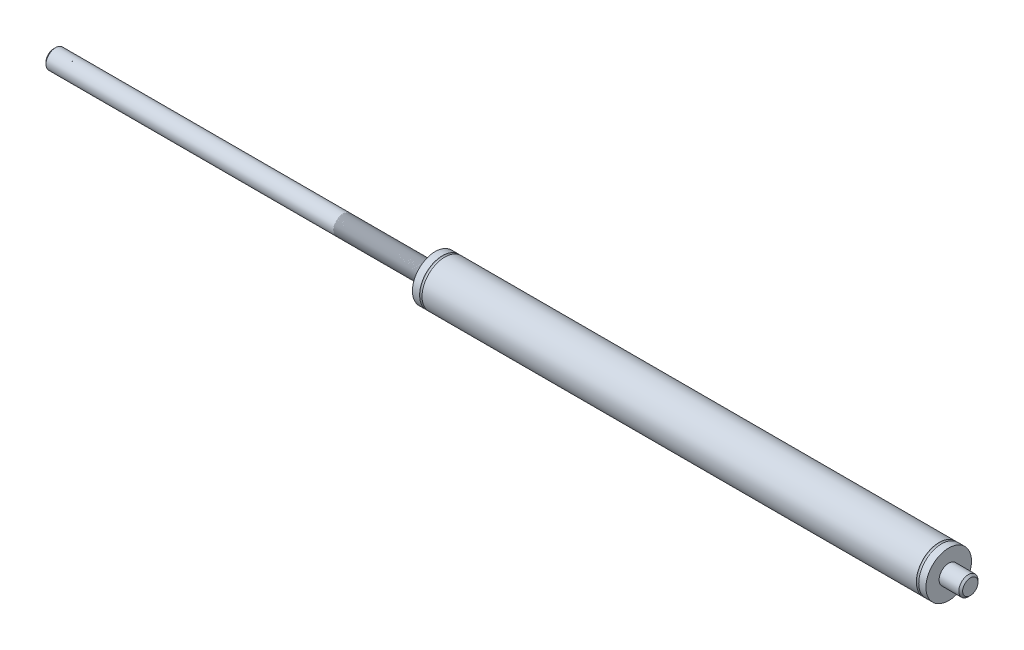
ISO-10303-21;
HEADER;
FILE_DESCRIPTION(('STEP AP214'),'2;1');
FILE_NAME('part.step','',(''),(''),'','','');
FILE_SCHEMA(('AUTOMOTIVE_DESIGN { 1 0 10303 214 1 1 1 1 }'));
ENDSEC;
DATA;
#1=APPLICATION_CONTEXT('core data for automotive mechanical design processes');
#2=APPLICATION_PROTOCOL_DEFINITION('international standard','automotive_design',2000,#1);
#3=PRODUCT_CONTEXT('',#1,'mechanical');
#4=PRODUCT('Part','Part','',(#3));
#5=PRODUCT_RELATED_PRODUCT_CATEGORY('part','',(#4));
#6=PRODUCT_DEFINITION_FORMATION('','',#4);
#7=PRODUCT_DEFINITION_CONTEXT('part definition',#1,'design');
#8=PRODUCT_DEFINITION('design','',#6,#7);
#9=PRODUCT_DEFINITION_SHAPE('','',#8);
#10=(LENGTH_UNIT() NAMED_UNIT(*) SI_UNIT(.MILLI.,.METRE.));
#11=(NAMED_UNIT(*) PLANE_ANGLE_UNIT() SI_UNIT($,.RADIAN.));
#12=(NAMED_UNIT(*) SI_UNIT($,.STERADIAN.) SOLID_ANGLE_UNIT());
#13=UNCERTAINTY_MEASURE_WITH_UNIT(LENGTH_MEASURE(1.E-05),#10,'distance_accuracy_value','');
#14=(GEOMETRIC_REPRESENTATION_CONTEXT(3) GLOBAL_UNCERTAINTY_ASSIGNED_CONTEXT((#13)) GLOBAL_UNIT_ASSIGNED_CONTEXT((#10,
#11,#12)) REPRESENTATION_CONTEXT('',''));
#15=CARTESIAN_POINT('',(0.,0.,0.));
#16=DIRECTION('',(0.,0.,1.));
#17=DIRECTION('',(1.,0.,0.));
#18=AXIS2_PLACEMENT_3D('',#15,#16,#17);
#19=CARTESIAN_POINT('',(-150.0001,4.04800210819405,-4.));
#20=DIRECTION('',(1.,0.,0.));
#21=DIRECTION('',(0.,0.,1.));
#22=AXIS2_PLACEMENT_3D('',#19,#20,#21);
#23=PLANE('',#22);
#24=CARTESIAN_POINT('',(-150.0001,0.,-4.));
#25=CARTESIAN_POINT('',(-150.0001,-0.500233775881683,-4.00000416861514));
#26=CARTESIAN_POINT('',(-150.0001,-0.984615384615385,-3.87692307692308));
#27=CARTESIAN_POINT('',(-150.0001,-1.45499480908051,-3.75739993230162));
#28=CARTESIAN_POINT('',(-150.0001,-1.88235294117647,-3.52941176470588));
#29=CARTESIAN_POINT('',(-150.0001,-2.28610208629266,-3.31401858308576));
#30=CARTESIAN_POINT('',(-150.0001,-2.63013698630137,-3.01369863013699));
#31=CARTESIAN_POINT('',(-150.0001,-2.94768870306678,-2.73649676301427));
#32=CARTESIAN_POINT('',(-150.0001,-3.2,-2.4));
#33=CARTESIAN_POINT('',(-150.0001,-3.63658069297695,-1.81775104100806));
#34=CARTESIAN_POINT('',(-150.0001,-3.84,-1.12));
#35=CARTESIAN_POINT('',(-150.0001,-3.99992379738115,-0.57144343603523));
#36=CARTESIAN_POINT('',(-150.0001,-4.,0.));
#37=B_SPLINE_CURVE_WITH_KNOTS('',2,(#24,#25,#26,#27,#28,#29,#30,#31,#32,#33,#34,#35,#36),
.UNSPECIFIED.,.F.,.F.,(3,2,2,2,2,2,3),(0.,0.125,0.25,0.375,0.5,0.75,1.),.UNSPECIFIED.);
#38=CARTESIAN_POINT('',(-150.00005,0.,-4.));
#39=VERTEX_POINT('',#38);
#40=CARTESIAN_POINT('',(-150.00005,-4.,0.));
#41=VERTEX_POINT('',#40);
#42=EDGE_CURVE('P0_E11',#39,#41,#37,.T.);
#43=ORIENTED_EDGE('',*,*,#42,.T.);
#44=CARTESIAN_POINT('',(-150.0001,-4.,0.));
#45=CARTESIAN_POINT('',(-150.0001,-3.99992373243989,0.571930430548999));
#46=CARTESIAN_POINT('',(-150.0001,-3.84,1.12));
#47=CARTESIAN_POINT('',(-150.0001,-3.63614901433663,1.81861127076107));
#48=CARTESIAN_POINT('',(-150.0001,-3.2,2.4));
#49=CARTESIAN_POINT('',(-150.0001,-2.94704642677385,2.73718832706312));
#50=CARTESIAN_POINT('',(-150.0001,-2.63013698630137,3.01369863013699));
#51=CARTESIAN_POINT('',(-150.0001,-2.28531676989029,3.31456168553752));
#52=CARTESIAN_POINT('',(-150.0001,-1.88235294117647,3.52941176470588));
#53=CARTESIAN_POINT('',(-150.0001,-1.45407456507855,3.75775891761147));
#54=CARTESIAN_POINT('',(-150.0001,-0.984615384615386,3.87692307692308));
#55=CARTESIAN_POINT('',(-150.0001,-0.499757885158302,3.99999583535061));
#56=CARTESIAN_POINT('',(-150.0001,0.,4.));
#57=B_SPLINE_CURVE_WITH_KNOTS('',2,(#44,#45,#46,#47,#48,#49,#50,#51,#52,#53,#54,#55,#56),
.UNSPECIFIED.,.F.,.F.,(3,2,2,2,2,2,3),(0.,0.25,0.5,0.625,0.75,0.875,1.),.UNSPECIFIED.);
#58=CARTESIAN_POINT('',(-150.00005,0.,4.));
#59=VERTEX_POINT('',#58);
#60=EDGE_CURVE('P0_E43',#41,#59,#57,.T.);
#61=ORIENTED_EDGE('',*,*,#60,.T.);
#62=CARTESIAN_POINT('',(-150.0001,0.,4.));
#63=CARTESIAN_POINT('',(-150.0001,0.500233775881882,4.00000416861514));
#64=CARTESIAN_POINT('',(-150.0001,0.984615384615385,3.87692307692308));
#65=CARTESIAN_POINT('',(-150.0001,1.45499480912804,3.75739993228949));
#66=CARTESIAN_POINT('',(-150.0001,1.88235294117647,3.52941176470588));
#67=CARTESIAN_POINT('',(-150.0001,2.28610208627952,3.31401858308026));
#68=CARTESIAN_POINT('',(-150.0001,2.63013698630137,3.01369863013699));
#69=CARTESIAN_POINT('',(-150.0001,2.9476887030197,2.73649676307103));
#70=CARTESIAN_POINT('',(-150.0001,3.2,2.4));
#71=CARTESIAN_POINT('',(-150.0001,3.63658069299503,1.81775104099438));
#72=CARTESIAN_POINT('',(-150.0001,3.84,1.12));
#73=CARTESIAN_POINT('',(-150.0001,3.999923797381,0.571443435997744));
#74=CARTESIAN_POINT('',(-150.0001,4.,0.));
#75=B_SPLINE_CURVE_WITH_KNOTS('',2,(#62,#63,#64,#65,#66,#67,#68,#69,#70,#71,#72,#73,#74),
.UNSPECIFIED.,.F.,.F.,(3,2,2,2,2,2,3),(0.,0.125,0.25,0.375,0.5,0.75,1.),.UNSPECIFIED.);
#76=CARTESIAN_POINT('',(-150.00005,4.,0.));
#77=VERTEX_POINT('',#76);
#78=EDGE_CURVE('P0_E33',#59,#77,#75,.T.);
#79=ORIENTED_EDGE('',*,*,#78,.T.);
#80=CARTESIAN_POINT('',(-150.0001,4.,0.));
#81=CARTESIAN_POINT('',(-150.0001,3.99992373243973,-0.57193043056434));
#82=CARTESIAN_POINT('',(-150.0001,3.84,-1.12));
#83=CARTESIAN_POINT('',(-150.0001,3.63614901433269,-1.81861127075573));
#84=CARTESIAN_POINT('',(-150.0001,3.2,-2.4));
#85=CARTESIAN_POINT('',(-150.0001,2.94704642678324,-2.73718832705675));
#86=CARTESIAN_POINT('',(-150.0001,2.63013698630137,-3.01369863013699));
#87=CARTESIAN_POINT('',(-150.0001,2.28531676988557,-3.31456168553965));
#88=CARTESIAN_POINT('',(-150.0001,1.88235294117647,-3.52941176470588));
#89=CARTESIAN_POINT('',(-150.0001,1.45407456509357,-3.75775891760387));
#90=CARTESIAN_POINT('',(-150.0001,0.984615384615385,-3.87692307692308));
#91=CARTESIAN_POINT('',(-150.0001,0.499757885173724,-3.99999583535061));
#92=CARTESIAN_POINT('',(-150.0001,0.,-4.));
#93=B_SPLINE_CURVE_WITH_KNOTS('',2,(#80,#81,#82,#83,#84,#85,#86,#87,#88,#89,#90,#91,#92),
.UNSPECIFIED.,.F.,.F.,(3,2,2,2,2,2,3),(0.,0.25,0.5,0.625,0.75,0.875,1.),.UNSPECIFIED.);
#94=EDGE_CURVE('P0_E26',#77,#39,#93,.T.);
#95=ORIENTED_EDGE('',*,*,#94,.T.);
#96=EDGE_LOOP('',(#43,#61,#79,#95));
#97=FACE_BOUND('',#96,.T.);
#98=ADVANCED_FACE('P0_F16',(#97),#23,.F.);
#99=CARTESIAN_POINT('',(-150.,4.,-4.04800210819405));
#100=DIRECTION('',(-1.,0.,0.));
#101=DIRECTION('',(0.,-1.,0.));
#102=AXIS2_PLACEMENT_3D('',#99,#100,#101);
#103=PLANE('',#102);
#104=ORIENTED_EDGE('',*,*,#78,.F.);
#105=ORIENTED_EDGE('',*,*,#60,.F.);
#106=ORIENTED_EDGE('',*,*,#42,.F.);
#107=ORIENTED_EDGE('',*,*,#94,.F.);
#108=EDGE_LOOP('',(#104,#105,#106,#107));
#109=FACE_BOUND('',#108,.T.);
#110=ADVANCED_FACE('P0_F45',(#109),#103,.F.);
#111=CLOSED_SHELL('',(#98,#110));
#112=MANIFOLD_SOLID_BREP('P0_B1',#111);
#113=CARTESIAN_POINT('',(-39.1121,3.16597578545373,3.27167321427358));
#114=DIRECTION('',(-1.,0.,0.));
#115=DIRECTION('',(0.,0.0223797657626337,-0.999749541677519));
#116=AXIS2_PLACEMENT_3D('',#113,#114,#115);
#117=PLANE('',#116);
#118=CARTESIAN_POINT('',(-39.1121,0.,0.));
#119=DIRECTION('',(1.,0.,0.));
#120=DIRECTION('',(0.,0.0223797657626337,-0.999749541677519));
#121=AXIS2_PLACEMENT_3D('',#118,#119,#120);
#122=CIRCLE('',#121,3.2);
#123=CARTESIAN_POINT('',(-39.1121,0.0716152504404279,-3.19919853336806));
#124=VERTEX_POINT('',#123);
#125=EDGE_CURVE('P1_E17',#124,#124,#122,.T.);
#126=ORIENTED_EDGE('',*,*,#125,.F.);
#127=EDGE_LOOP('',(#126));
#128=FACE_BOUND('',#127,.T.);
#129=ADVANCED_FACE('P1_F14',(#128),#117,.T.);
#130=CARTESIAN_POINT('',(-39.1121,0.,0.));
#131=DIRECTION('',(1.,0.,0.));
#132=DIRECTION('',(0.,0.0223797657626337,-0.999749541677519));
#133=AXIS2_PLACEMENT_3D('',#130,#131,#132);
#134=CONICAL_SURFACE('',#133,3.2,0.785398163397434);
#135=CARTESIAN_POINT('',(-38.3121,0.,0.));
#136=DIRECTION('',(1.,0.,0.));
#137=DIRECTION('',(0.,-0.0223797657626337,0.999749541677519));
#138=AXIS2_PLACEMENT_3D('',#135,#136,#137);
#139=CIRCLE('',#138,4.);
#140=CARTESIAN_POINT('',(-38.3121,-0.0895190630505348,3.99899816671008));
#141=VERTEX_POINT('',#140);
#142=EDGE_CURVE('P1_E21',#141,#141,#139,.T.);
#143=ORIENTED_EDGE('',*,*,#142,.F.);
#144=EDGE_LOOP('',(#143));
#145=FACE_BOUND('',#144,.T.);
#146=ORIENTED_EDGE('',*,*,#125,.T.);
#147=EDGE_LOOP('',(#146));
#148=FACE_BOUND('',#147,.T.);
#149=ADVANCED_FACE('P1_F31',(#145,#148),#134,.T.);
#150=CARTESIAN_POINT('',(119.887,-3.90840482772205,-4.13650731542717));
#151=DIRECTION('',(1.,0.,0.));
#152=DIRECTION('',(0.,0.999749541677519,0.0223797657626337));
#153=AXIS2_PLACEMENT_3D('',#150,#151,#152);
#154=PLANE('',#153);
#155=CARTESIAN_POINT('',(119.887,0.,0.));
#156=DIRECTION('',(-1.,0.,0.));
#157=DIRECTION('',(0.,-0.0223797657626337,0.999749541677519));
#158=AXIS2_PLACEMENT_3D('',#155,#156,#157);
#159=CIRCLE('',#158,4.);
#160=CARTESIAN_POINT('',(119.887,-0.0895190630505348,3.99899816671008));
#161=VERTEX_POINT('',#160);
#162=EDGE_CURVE('P1_E10',#161,#161,#159,.T.);
#163=ORIENTED_EDGE('',*,*,#162,.F.);
#164=EDGE_LOOP('',(#163));
#165=FACE_BOUND('',#164,.T.);
#166=ADVANCED_FACE('P1_F38',(#165),#154,.T.);
#167=CARTESIAN_POINT('',(-30.112,0.,0.));
#168=DIRECTION('',(-1.,0.,0.));
#169=DIRECTION('',(0.,-0.0223797657626337,0.999749541677519));
#170=AXIS2_PLACEMENT_3D('',#167,#168,#169);
#171=CYLINDRICAL_SURFACE('',#170,4.);
#172=ORIENTED_EDGE('',*,*,#142,.T.);
#173=EDGE_LOOP('',(#172));
#174=FACE_BOUND('',#173,.T.);
#175=ORIENTED_EDGE('',*,*,#162,.T.);
#176=EDGE_LOOP('',(#175));
#177=FACE_BOUND('',#176,.T.);
#178=ADVANCED_FACE('P1_F40',(#174,#177),#171,.T.);
#179=CLOSED_SHELL('',(#129,#149,#166,#178));
#180=MANIFOLD_SOLID_BREP('P1_B1',#179);
#181=CARTESIAN_POINT('',(-159.0001,3.23840212065681,3.2));
#182=DIRECTION('',(-1.,0.,0.));
#183=DIRECTION('',(0.,0.,-1.));
#184=AXIS2_PLACEMENT_3D('',#181,#182,#183);
#185=PLANE('',#184);
#186=CARTESIAN_POINT('',(-159.0001,0.,0.));
#187=DIRECTION('',(1.,0.,0.));
#188=DIRECTION('',(0.,0.,-1.));
#189=AXIS2_PLACEMENT_3D('',#186,#187,#188);
#190=CIRCLE('',#189,3.2);
#191=CARTESIAN_POINT('',(-159.0001,0.,-3.2));
#192=VERTEX_POINT('',#191);
#193=EDGE_CURVE('P2_E17',#192,#192,#190,.T.);
#194=ORIENTED_EDGE('',*,*,#193,.F.);
#195=EDGE_LOOP('',(#194));
#196=FACE_BOUND('',#195,.T.);
#197=ADVANCED_FACE('P2_F14',(#196),#185,.T.);
#198=CARTESIAN_POINT('',(-159.0001,0.,0.));
#199=DIRECTION('',(1.,0.,0.));
#200=DIRECTION('',(0.,0.,-1.));
#201=AXIS2_PLACEMENT_3D('',#198,#199,#200);
#202=CONICAL_SURFACE('',#201,3.2,0.785398163397434);
#203=CARTESIAN_POINT('',(-158.2001,0.,0.));
#204=DIRECTION('',(1.,0.,0.));
#205=DIRECTION('',(0.,0.,1.));
#206=AXIS2_PLACEMENT_3D('',#203,#204,#205);
#207=CIRCLE('',#206,4.);
#208=CARTESIAN_POINT('',(-158.2001,0.,4.));
#209=VERTEX_POINT('',#208);
#210=EDGE_CURVE('P2_E21',#209,#209,#207,.T.);
#211=ORIENTED_EDGE('',*,*,#210,.F.);
#212=EDGE_LOOP('',(#211));
#213=FACE_BOUND('',#212,.T.);
#214=ORIENTED_EDGE('',*,*,#193,.T.);
#215=EDGE_LOOP('',(#214));
#216=FACE_BOUND('',#215,.T.);
#217=ADVANCED_FACE('P2_F31',(#213,#216),#202,.T.);
#218=CARTESIAN_POINT('',(-0.001,-4.,-4.04800210819405));
#219=DIRECTION('',(1.,0.,0.));
#220=DIRECTION('',(0.,1.,0.));
#221=AXIS2_PLACEMENT_3D('',#218,#219,#220);
#222=PLANE('',#221);
#223=CARTESIAN_POINT('',(-0.001000000000001,0.,0.));
#224=DIRECTION('',(-1.,0.,0.));
#225=DIRECTION('',(0.,0.,1.));
#226=AXIS2_PLACEMENT_3D('',#223,#224,#225);
#227=CIRCLE('',#226,4.);
#228=CARTESIAN_POINT('',(-0.001000000000001,0.,4.));
#229=VERTEX_POINT('',#228);
#230=EDGE_CURVE('P2_E10',#229,#229,#227,.T.);
#231=ORIENTED_EDGE('',*,*,#230,.F.);
#232=EDGE_LOOP('',(#231));
#233=FACE_BOUND('',#232,.T.);
#234=ADVANCED_FACE('P2_F38',(#233),#222,.T.);
#235=CARTESIAN_POINT('',(-150.,0.,0.));
#236=DIRECTION('',(-1.,0.,0.));
#237=DIRECTION('',(0.,0.,1.));
#238=AXIS2_PLACEMENT_3D('',#235,#236,#237);
#239=CYLINDRICAL_SURFACE('',#238,4.);
#240=ORIENTED_EDGE('',*,*,#210,.T.);
#241=EDGE_LOOP('',(#240));
#242=FACE_BOUND('',#241,.T.);
#243=ORIENTED_EDGE('',*,*,#230,.T.);
#244=EDGE_LOOP('',(#243));
#245=FACE_BOUND('',#244,.T.);
#246=ADVANCED_FACE('P2_F40',(#242,#245),#239,.T.);
#247=CLOSED_SHELL('',(#197,#217,#234,#246));
#248=MANIFOLD_SOLID_BREP('P2_B1',#247);
#249=CARTESIAN_POINT('',(223.,3.23840212065681,-3.2));
#250=DIRECTION('',(1.,0.,0.));
#251=DIRECTION('',(0.,0.,1.));
#252=AXIS2_PLACEMENT_3D('',#249,#250,#251);
#253=PLANE('',#252);
#254=CARTESIAN_POINT('',(223.,0.,0.));
#255=DIRECTION('',(-1.,0.,0.));
#256=DIRECTION('',(0.,0.,1.));
#257=AXIS2_PLACEMENT_3D('',#254,#255,#256);
#258=CIRCLE('',#257,3.2);
#259=CARTESIAN_POINT('',(223.,0.,3.2));
#260=VERTEX_POINT('',#259);
#261=EDGE_CURVE('P3_E17',#260,#260,#258,.T.);
#262=ORIENTED_EDGE('',*,*,#261,.F.);
#263=EDGE_LOOP('',(#262));
#264=FACE_BOUND('',#263,.T.);
#265=ADVANCED_FACE('P3_F14',(#264),#253,.T.);
#266=CARTESIAN_POINT('',(223.,0.,0.));
#267=DIRECTION('',(-1.,0.,0.));
#268=DIRECTION('',(0.,0.,1.));
#269=AXIS2_PLACEMENT_3D('',#266,#267,#268);
#270=CONICAL_SURFACE('',#269,3.2,0.785398163397434);
#271=CARTESIAN_POINT('',(222.2,0.,0.));
#272=DIRECTION('',(-1.,0.,0.));
#273=DIRECTION('',(0.,0.,-1.));
#274=AXIS2_PLACEMENT_3D('',#271,#272,#273);
#275=CIRCLE('',#274,4.);
#276=CARTESIAN_POINT('',(222.2,0.,-4.));
#277=VERTEX_POINT('',#276);
#278=EDGE_CURVE('P3_E90',#277,#277,#275,.T.);
#279=ORIENTED_EDGE('',*,*,#278,.F.);
#280=EDGE_LOOP('',(#279));
#281=FACE_BOUND('',#280,.T.);
#282=ORIENTED_EDGE('',*,*,#261,.T.);
#283=EDGE_LOOP('',(#282));
#284=FACE_BOUND('',#283,.T.);
#285=ADVANCED_FACE('P3_F60',(#281,#284),#270,.T.);
#286=CARTESIAN_POINT('',(214.,0.,0.));
#287=DIRECTION('',(-1.,0.,0.));
#288=DIRECTION('',(0.,0.,1.));
#289=AXIS2_PLACEMENT_3D('',#286,#287,#288);
#290=CYLINDRICAL_SURFACE('',#289,4.);
#291=CARTESIAN_POINT('',(214.,0.,0.));
#292=DIRECTION('',(-1.,0.,0.));
#293=DIRECTION('',(0.,0.,1.));
#294=AXIS2_PLACEMENT_3D('',#291,#292,#293);
#295=CIRCLE('',#294,4.);
#296=CARTESIAN_POINT('',(214.,0.,4.));
#297=VERTEX_POINT('',#296);
#298=EDGE_CURVE('P3_E92',#297,#297,#295,.T.);
#299=ORIENTED_EDGE('',*,*,#298,.F.);
#300=EDGE_LOOP('',(#299));
#301=FACE_BOUND('',#300,.T.);
#302=ORIENTED_EDGE('',*,*,#278,.T.);
#303=EDGE_LOOP('',(#302));
#304=FACE_BOUND('',#303,.T.);
#305=ADVANCED_FACE('P3_F57',(#301,#304),#290,.T.);
#306=CARTESIAN_POINT('',(214.,9.5,9.614002108296));
#307=DIRECTION('',(1.,0.,0.));
#308=DIRECTION('',(0.,-1.,0.));
#309=AXIS2_PLACEMENT_3D('',#306,#307,#308);
#310=PLANE('',#309);
#311=ORIENTED_EDGE('',*,*,#298,.T.);
#312=EDGE_LOOP('',(#311));
#313=FACE_BOUND('',#312,.T.);
#314=CARTESIAN_POINT('',(214.,0.,0.));
#315=DIRECTION('',(-1.,0.,0.));
#316=DIRECTION('',(0.,0.,1.));
#317=AXIS2_PLACEMENT_3D('',#314,#315,#316);
#318=CIRCLE('',#317,9.5);
#319=CARTESIAN_POINT('',(214.,0.,9.5));
#320=VERTEX_POINT('',#319);
#321=EDGE_CURVE('P3_E87',#320,#320,#318,.T.);
#322=ORIENTED_EDGE('',*,*,#321,.F.);
#323=EDGE_LOOP('',(#322));
#324=FACE_BOUND('',#323,.T.);
#325=ADVANCED_FACE('P3_F53',(#313,#324),#310,.T.);
#326=CARTESIAN_POINT('',(211.,0.,0.));
#327=DIRECTION('',(-1.,0.,0.));
#328=DIRECTION('',(0.,0.,1.));
#329=AXIS2_PLACEMENT_3D('',#326,#327,#328);
#330=CYLINDRICAL_SURFACE('',#329,9.5);
#331=ORIENTED_EDGE('',*,*,#321,.T.);
#332=EDGE_LOOP('',(#331));
#333=FACE_BOUND('',#332,.T.);
#334=CARTESIAN_POINT('',(211.,0.,0.));
#335=DIRECTION('',(-1.,0.,0.));
#336=DIRECTION('',(0.,-1.,0.));
#337=AXIS2_PLACEMENT_3D('',#334,#335,#336);
#338=CIRCLE('',#337,9.5);
#339=CARTESIAN_POINT('',(211.,-9.5,0.));
#340=VERTEX_POINT('',#339);
#341=EDGE_CURVE('P3_E82',#340,#340,#338,.T.);
#342=ORIENTED_EDGE('',*,*,#341,.F.);
#343=EDGE_LOOP('',(#342));
#344=FACE_BOUND('',#343,.T.);
#345=ADVANCED_FACE('P3_F49',(#333,#344),#330,.T.);
#346=CARTESIAN_POINT('',(0.,-9.5,9.61400210829618));
#347=DIRECTION('',(-1.,0.,0.));
#348=DIRECTION('',(0.,1.,0.));
#349=AXIS2_PLACEMENT_3D('',#346,#347,#348);
#350=PLANE('',#349);
#351=CARTESIAN_POINT('',(0.,0.,0.));
#352=DIRECTION('',(-1.,0.,0.));
#353=DIRECTION('',(0.,0.,1.));
#354=AXIS2_PLACEMENT_3D('',#351,#352,#353);
#355=CIRCLE('',#354,9.5);
#356=CARTESIAN_POINT('',(0.,0.,9.5));
#357=VERTEX_POINT('',#356);
#358=EDGE_CURVE('P3_E80',#357,#357,#355,.F.);
#359=ORIENTED_EDGE('',*,*,#358,.F.);
#360=EDGE_LOOP('',(#359));
#361=FACE_BOUND('',#360,.T.);
#362=ADVANCED_FACE('P3_F45',(#361),#350,.T.);
#363=CARTESIAN_POINT('',(0.,0.,0.));
#364=DIRECTION('',(-1.,0.,0.));
#365=DIRECTION('',(0.,0.,1.));
#366=AXIS2_PLACEMENT_3D('',#363,#364,#365);
#367=CYLINDRICAL_SURFACE('',#366,9.5);
#368=CARTESIAN_POINT('',(3.,0.,0.));
#369=DIRECTION('',(-1.,0.,0.));
#370=DIRECTION('',(0.,-1.,0.));
#371=AXIS2_PLACEMENT_3D('',#368,#369,#370);
#372=CIRCLE('',#371,9.5);
#373=CARTESIAN_POINT('',(3.,-9.5,0.));
#374=VERTEX_POINT('',#373);
#375=EDGE_CURVE('P3_E26',#374,#374,#372,.F.);
#376=ORIENTED_EDGE('',*,*,#375,.F.);
#377=EDGE_LOOP('',(#376));
#378=FACE_BOUND('',#377,.T.);
#379=ORIENTED_EDGE('',*,*,#358,.T.);
#380=EDGE_LOOP('',(#379));
#381=FACE_BOUND('',#380,.T.);
#382=ADVANCED_FACE('P3_F40',(#378,#381),#367,.T.);
#383=CARTESIAN_POINT('',(210.5,0.,0.));
#384=DIRECTION('',(-1.,0.,0.));
#385=DIRECTION('',(0.,-1.,0.));
#386=AXIS2_PLACEMENT_3D('',#383,#384,#385);
#387=TOROIDAL_SURFACE('',#386,9.5,0.5);
#388=ORIENTED_EDGE('',*,*,#341,.T.);
#389=EDGE_LOOP('',(#388));
#390=FACE_BOUND('',#389,.T.);
#391=CARTESIAN_POINT('',(210.,0.,0.));
#392=DIRECTION('',(-1.,0.,0.));
#393=DIRECTION('',(0.,1.,0.));
#394=AXIS2_PLACEMENT_3D('',#391,#392,#393);
#395=CIRCLE('',#394,9.5);
#396=CARTESIAN_POINT('',(210.,9.5,0.));
#397=VERTEX_POINT('',#396);
#398=EDGE_CURVE('P3_E21',#397,#397,#395,.T.);
#399=ORIENTED_EDGE('',*,*,#398,.F.);
#400=EDGE_LOOP('',(#399));
#401=FACE_BOUND('',#400,.T.);
#402=ADVANCED_FACE('P3_F35',(#390,#401),#387,.F.);
#403=CARTESIAN_POINT('',(3.99999999999999,0.,0.));
#404=DIRECTION('',(-1.,0.,0.));
#405=DIRECTION('',(0.,0.,1.));
#406=AXIS2_PLACEMENT_3D('',#403,#404,#405);
#407=CYLINDRICAL_SURFACE('',#406,9.5);
#408=ORIENTED_EDGE('',*,*,#398,.T.);
#409=EDGE_LOOP('',(#408));
#410=FACE_BOUND('',#409,.T.);
#411=CARTESIAN_POINT('',(4.,0.,0.));
#412=DIRECTION('',(-1.,0.,0.));
#413=DIRECTION('',(0.,-1.,0.));
#414=AXIS2_PLACEMENT_3D('',#411,#412,#413);
#415=CIRCLE('',#414,9.5);
#416=CARTESIAN_POINT('',(4.,-9.5,0.));
#417=VERTEX_POINT('',#416);
#418=EDGE_CURVE('P3_E10',#417,#417,#415,.T.);
#419=ORIENTED_EDGE('',*,*,#418,.F.);
#420=EDGE_LOOP('',(#419));
#421=FACE_BOUND('',#420,.T.);
#422=ADVANCED_FACE('P3_F39',(#410,#421),#407,.T.);
#423=CARTESIAN_POINT('',(3.5,0.,0.));
#424=DIRECTION('',(-1.,0.,0.));
#425=DIRECTION('',(0.,-1.,0.));
#426=AXIS2_PLACEMENT_3D('',#423,#424,#425);
#427=TOROIDAL_SURFACE('',#426,9.5,0.5);
#428=ORIENTED_EDGE('',*,*,#375,.T.);
#429=EDGE_LOOP('',(#428));
#430=FACE_BOUND('',#429,.T.);
#431=ORIENTED_EDGE('',*,*,#418,.T.);
#432=EDGE_LOOP('',(#431));
#433=FACE_BOUND('',#432,.T.);
#434=ADVANCED_FACE('P3_F71',(#430,#433),#427,.F.);
#435=CLOSED_SHELL('',(#265,#285,#305,#325,#345,#362,#382,#402,#422,#434));
#436=MANIFOLD_SOLID_BREP('P3_B1',#435);
#437=ADVANCED_BREP_SHAPE_REPRESENTATION('',(#18,#112,#180,#248,#436),#14);
#438=SHAPE_DEFINITION_REPRESENTATION(#9,#437);
ENDSEC;
END-ISO-10303-21;
